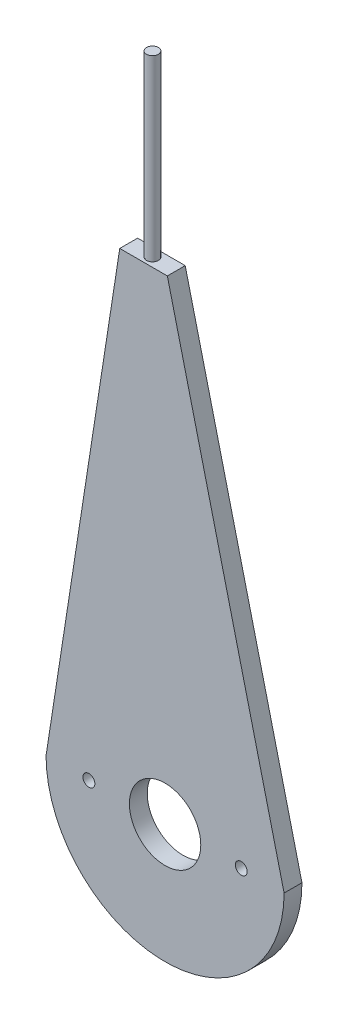
ISO-10303-21;
HEADER;
FILE_DESCRIPTION(('STEP AP214'),'2;1');
FILE_NAME('part.step','',(''),(''),'','','');
FILE_SCHEMA(('AUTOMOTIVE_DESIGN { 1 0 10303 214 1 1 1 1 }'));
ENDSEC;
DATA;
#1=APPLICATION_CONTEXT('core data for automotive mechanical design processes');
#2=APPLICATION_PROTOCOL_DEFINITION('international standard','automotive_design',2000,#1);
#3=PRODUCT_CONTEXT('',#1,'mechanical');
#4=PRODUCT('Part','Part','',(#3));
#5=PRODUCT_RELATED_PRODUCT_CATEGORY('part','',(#4));
#6=PRODUCT_DEFINITION_FORMATION('','',#4);
#7=PRODUCT_DEFINITION_CONTEXT('part definition',#1,'design');
#8=PRODUCT_DEFINITION('design','',#6,#7);
#9=PRODUCT_DEFINITION_SHAPE('','',#8);
#10=(LENGTH_UNIT() NAMED_UNIT(*) SI_UNIT(.MILLI.,.METRE.));
#11=(NAMED_UNIT(*) PLANE_ANGLE_UNIT() SI_UNIT($,.RADIAN.));
#12=(NAMED_UNIT(*) SI_UNIT($,.STERADIAN.) SOLID_ANGLE_UNIT());
#13=UNCERTAINTY_MEASURE_WITH_UNIT(LENGTH_MEASURE(1.E-05),#10,'distance_accuracy_value','');
#14=(GEOMETRIC_REPRESENTATION_CONTEXT(3) GLOBAL_UNCERTAINTY_ASSIGNED_CONTEXT((#13)) GLOBAL_UNIT_ASSIGNED_CONTEXT((#10,
#11,#12)) REPRESENTATION_CONTEXT('',''));
#15=CARTESIAN_POINT('',(0.,0.,0.));
#16=DIRECTION('',(0.,0.,1.));
#17=DIRECTION('',(1.,0.,0.));
#18=AXIS2_PLACEMENT_3D('',#15,#16,#17);
#19=CARTESIAN_POINT('',(-34.2369002432551,-273.477678772343,7.5));
#20=DIRECTION('',(0.988233155114014,-0.15295499708542,0.));
#21=DIRECTION('',(0.15295499708542,0.988233155114014,0.));
#22=AXIS2_PLACEMENT_3D('',#19,#20,#21);
#23=PLANE('',#22);
#24=DIRECTION('',(-0.15295499708542,-0.988233155114014,0.));
#25=VECTOR('',#24,1.);
#26=CARTESIAN_POINT('',(-34.2369002432551,-273.477678772343,0.));
#27=LINE('',#26,#25);
#28=CARTESIAN_POINT('',(-34.2369002432551,-273.477678772343,0.));
#29=VERTEX_POINT('',#28);
#30=CARTESIAN_POINT('',(-65.1921452264642,-473.477678772343,0.));
#31=VERTEX_POINT('',#30);
#32=EDGE_CURVE('E100',#29,#31,#27,.T.);
#33=ORIENTED_EDGE('',*,*,#32,.T.);
#34=DIRECTION('',(0.,0.,-1.));
#35=VECTOR('',#34,1.);
#36=CARTESIAN_POINT('',(-65.1921452264642,-473.477678772343,7.5));
#37=LINE('',#36,#35);
#38=CARTESIAN_POINT('',(-65.1921452264642,-473.477678772343,7.5));
#39=VERTEX_POINT('',#38);
#40=EDGE_CURVE('E37',#39,#31,#37,.T.);
#41=ORIENTED_EDGE('',*,*,#40,.F.);
#42=DIRECTION('',(-0.15295499708542,-0.988233155114014,0.));
#43=VECTOR('',#42,1.);
#44=CARTESIAN_POINT('',(-34.2369002432551,-273.477678772343,7.5));
#45=LINE('',#44,#43);
#46=CARTESIAN_POINT('',(-34.2369002432551,-273.477678772343,7.5));
#47=VERTEX_POINT('',#46);
#48=EDGE_CURVE('E87',#47,#39,#45,.T.);
#49=ORIENTED_EDGE('',*,*,#48,.F.);
#50=DIRECTION('',(0.,0.,-1.));
#51=VECTOR('',#50,1.);
#52=CARTESIAN_POINT('',(-34.2369002432551,-273.477678772343,7.5));
#53=LINE('',#52,#51);
#54=EDGE_CURVE('E96',#47,#29,#53,.T.);
#55=ORIENTED_EDGE('',*,*,#54,.T.);
#56=EDGE_LOOP('',(#33,#41,#49,#55));
#57=FACE_BOUND('',#56,.T.);
#58=ADVANCED_FACE('F34',(#57),#23,.F.);
#59=CARTESIAN_POINT('',(-15.1921452264642,-473.477678772343,7.5));
#60=DIRECTION('',(0.,0.,-1.));
#61=DIRECTION('',(-1.,0.,0.));
#62=AXIS2_PLACEMENT_3D('',#59,#60,#61);
#63=CYLINDRICAL_SURFACE('',#62,50.);
#64=CARTESIAN_POINT('',(-15.1921452264642,-473.477678772343,0.));
#65=DIRECTION('',(0.,0.,1.));
#66=DIRECTION('',(1.,0.,0.));
#67=AXIS2_PLACEMENT_3D('',#64,#65,#66);
#68=CIRCLE('',#67,50.);
#69=CARTESIAN_POINT('',(34.8078547735359,-473.477678772343,0.));
#70=VERTEX_POINT('',#69);
#71=EDGE_CURVE('E92',#31,#70,#68,.T.);
#72=ORIENTED_EDGE('',*,*,#71,.T.);
#73=DIRECTION('',(0.,0.,-1.));
#74=VECTOR('',#73,1.);
#75=CARTESIAN_POINT('',(34.8078547735359,-473.477678772343,7.5));
#76=LINE('',#75,#74);
#77=CARTESIAN_POINT('',(34.8078547735359,-473.477678772343,7.5));
#78=VERTEX_POINT('',#77);
#79=EDGE_CURVE('E90',#78,#70,#76,.T.);
#80=ORIENTED_EDGE('',*,*,#79,.F.);
#81=CARTESIAN_POINT('',(-15.1921452264642,-473.477678772343,7.5));
#82=DIRECTION('',(0.,0.,1.));
#83=DIRECTION('',(1.,0.,0.));
#84=AXIS2_PLACEMENT_3D('',#81,#82,#83);
#85=CIRCLE('',#84,50.);
#86=EDGE_CURVE('E82',#39,#78,#85,.T.);
#87=ORIENTED_EDGE('',*,*,#86,.F.);
#88=ORIENTED_EDGE('',*,*,#40,.T.);
#89=EDGE_LOOP('',(#72,#80,#87,#88));
#90=FACE_BOUND('',#89,.T.);
#91=ADVANCED_FACE('F91',(#90),#63,.T.);
#92=CARTESIAN_POINT('',(-14.2369002432551,-273.477678772343,7.5));
#93=DIRECTION('',(-0.971224154994956,-0.238167253740587,0.));
#94=DIRECTION('',(0.238167253740587,-0.971224154994956,0.));
#95=AXIS2_PLACEMENT_3D('',#92,#93,#94);
#96=PLANE('',#95);
#97=DIRECTION('',(-0.238167253740587,0.971224154994956,0.));
#98=VECTOR('',#97,1.);
#99=CARTESIAN_POINT('',(-14.2369002432551,-273.477678772343,0.));
#100=LINE('',#99,#98);
#101=CARTESIAN_POINT('',(-14.2369002432551,-273.477678772343,0.));
#102=VERTEX_POINT('',#101);
#103=EDGE_CURVE('E68',#70,#102,#100,.T.);
#104=ORIENTED_EDGE('',*,*,#103,.T.);
#105=DIRECTION('',(0.,0.,-1.));
#106=VECTOR('',#105,1.);
#107=CARTESIAN_POINT('',(-14.2369002432551,-273.477678772343,7.5));
#108=LINE('',#107,#106);
#109=CARTESIAN_POINT('',(-14.2369002432551,-273.477678772343,7.5));
#110=VERTEX_POINT('',#109);
#111=EDGE_CURVE('E93',#110,#102,#108,.T.);
#112=ORIENTED_EDGE('',*,*,#111,.F.);
#113=DIRECTION('',(-0.238167253740587,0.971224154994956,0.));
#114=VECTOR('',#113,1.);
#115=CARTESIAN_POINT('',(-14.2369002432551,-273.477678772343,7.5));
#116=LINE('',#115,#114);
#117=EDGE_CURVE('E85',#78,#110,#116,.T.);
#118=ORIENTED_EDGE('',*,*,#117,.F.);
#119=ORIENTED_EDGE('',*,*,#79,.T.);
#120=EDGE_LOOP('',(#104,#112,#118,#119));
#121=FACE_BOUND('',#120,.T.);
#122=ADVANCED_FACE('F94',(#121),#96,.F.);
#123=CARTESIAN_POINT('',(-34.2369002432551,-273.477678772343,7.5));
#124=DIRECTION('',(0.,-1.,0.));
#125=DIRECTION('',(0.,0.,-1.));
#126=AXIS2_PLACEMENT_3D('',#123,#124,#125);
#127=PLANE('',#126);
#128=CARTESIAN_POINT('',(-24.2369002432551,-273.477678772343,3.75));
#129=DIRECTION('',(0.,1.,0.));
#130=DIRECTION('',(0.,0.,1.));
#131=AXIS2_PLACEMENT_3D('',#128,#129,#130);
#132=CIRCLE('',#131,2.5);
#133=CARTESIAN_POINT('',(-24.2369002432551,-273.477678772343,6.25));
#134=VERTEX_POINT('',#133);
#135=EDGE_CURVE('E11',#134,#134,#132,.T.);
#136=ORIENTED_EDGE('',*,*,#135,.F.);
#137=EDGE_LOOP('',(#136));
#138=FACE_BOUND('',#137,.T.);
#139=DIRECTION('',(-1.,0.,0.));
#140=VECTOR('',#139,1.);
#141=CARTESIAN_POINT('',(-34.2369002432551,-273.477678772343,0.));
#142=LINE('',#141,#140);
#143=EDGE_CURVE('E74',#102,#29,#142,.T.);
#144=ORIENTED_EDGE('',*,*,#143,.T.);
#145=ORIENTED_EDGE('',*,*,#54,.F.);
#146=DIRECTION('',(-1.,0.,0.));
#147=VECTOR('',#146,1.);
#148=CARTESIAN_POINT('',(-34.2369002432551,-273.477678772343,7.5));
#149=LINE('',#148,#147);
#150=EDGE_CURVE('E51',#110,#47,#149,.T.);
#151=ORIENTED_EDGE('',*,*,#150,.F.);
#152=ORIENTED_EDGE('',*,*,#111,.T.);
#153=EDGE_LOOP('',(#144,#145,#151,#152));
#154=FACE_BOUND('',#153,.T.);
#155=ADVANCED_FACE('F108',(#138,#154),#127,.F.);
#156=CARTESIAN_POINT('',(-15.1921452264642,-473.477678772343,7.5));
#157=DIRECTION('',(0.,0.,1.));
#158=DIRECTION('',(1.,0.,0.));
#159=AXIS2_PLACEMENT_3D('',#156,#157,#158);
#160=PLANE('',#159);
#161=CARTESIAN_POINT('',(16.8078547735358,-473.477678772343,7.5));
#162=DIRECTION('',(0.,0.,1.));
#163=DIRECTION('',(1.,0.,0.));
#164=AXIS2_PLACEMENT_3D('',#161,#162,#163);
#165=CIRCLE('',#164,2.5);
#166=CARTESIAN_POINT('',(19.3078547735358,-473.477678772343,7.5));
#167=VERTEX_POINT('',#166);
#168=EDGE_CURVE('E126',#167,#167,#165,.T.);
#169=ORIENTED_EDGE('',*,*,#168,.F.);
#170=EDGE_LOOP('',(#169));
#171=FACE_BOUND('',#170,.T.);
#172=CARTESIAN_POINT('',(-47.1921452264642,-473.477678772343,7.5));
#173=DIRECTION('',(0.,0.,1.));
#174=DIRECTION('',(1.,0.,0.));
#175=AXIS2_PLACEMENT_3D('',#172,#173,#174);
#176=CIRCLE('',#175,2.5);
#177=CARTESIAN_POINT('',(-44.6921452264642,-473.477678772343,7.5));
#178=VERTEX_POINT('',#177);
#179=EDGE_CURVE('E120',#178,#178,#176,.T.);
#180=ORIENTED_EDGE('',*,*,#179,.F.);
#181=EDGE_LOOP('',(#180));
#182=FACE_BOUND('',#181,.T.);
#183=CARTESIAN_POINT('',(-15.1921452264642,-473.477678772343,7.5));
#184=DIRECTION('',(0.,0.,1.));
#185=DIRECTION('',(1.,0.,0.));
#186=AXIS2_PLACEMENT_3D('',#183,#184,#185);
#187=CIRCLE('',#186,15.);
#188=CARTESIAN_POINT('',(-0.192145226464185,-473.477678772343,7.5));
#189=VERTEX_POINT('',#188);
#190=EDGE_CURVE('E117',#189,#189,#187,.T.);
#191=ORIENTED_EDGE('',*,*,#190,.F.);
#192=EDGE_LOOP('',(#191));
#193=FACE_BOUND('',#192,.T.);
#194=ORIENTED_EDGE('',*,*,#48,.T.);
#195=ORIENTED_EDGE('',*,*,#86,.T.);
#196=ORIENTED_EDGE('',*,*,#117,.T.);
#197=ORIENTED_EDGE('',*,*,#150,.T.);
#198=EDGE_LOOP('',(#194,#195,#196,#197));
#199=FACE_BOUND('',#198,.T.);
#200=ADVANCED_FACE('F83',(#171,#182,#193,#199),#160,.T.);
#201=CARTESIAN_POINT('',(-15.1921452264642,-473.477678772343,0.));
#202=DIRECTION('',(0.,0.,1.));
#203=DIRECTION('',(1.,0.,0.));
#204=AXIS2_PLACEMENT_3D('',#201,#202,#203);
#205=PLANE('',#204);
#206=CARTESIAN_POINT('',(16.8078547735358,-473.477678772343,0.));
#207=DIRECTION('',(0.,0.,1.));
#208=DIRECTION('',(1.,0.,0.));
#209=AXIS2_PLACEMENT_3D('',#206,#207,#208);
#210=CIRCLE('',#209,2.5);
#211=CARTESIAN_POINT('',(19.3078547735358,-473.477678772343,0.));
#212=VERTEX_POINT('',#211);
#213=EDGE_CURVE('E123',#212,#212,#210,.T.);
#214=ORIENTED_EDGE('',*,*,#213,.T.);
#215=EDGE_LOOP('',(#214));
#216=FACE_BOUND('',#215,.T.);
#217=CARTESIAN_POINT('',(-47.1921452264642,-473.477678772343,0.));
#218=DIRECTION('',(0.,0.,1.));
#219=DIRECTION('',(1.,0.,0.));
#220=AXIS2_PLACEMENT_3D('',#217,#218,#219);
#221=CIRCLE('',#220,2.5);
#222=CARTESIAN_POINT('',(-44.6921452264642,-473.477678772343,0.));
#223=VERTEX_POINT('',#222);
#224=EDGE_CURVE('E129',#223,#223,#221,.T.);
#225=ORIENTED_EDGE('',*,*,#224,.T.);
#226=EDGE_LOOP('',(#225));
#227=FACE_BOUND('',#226,.T.);
#228=CARTESIAN_POINT('',(-15.1921452264642,-473.477678772343,0.));
#229=DIRECTION('',(0.,0.,1.));
#230=DIRECTION('',(1.,0.,0.));
#231=AXIS2_PLACEMENT_3D('',#228,#229,#230);
#232=CIRCLE('',#231,15.);
#233=CARTESIAN_POINT('',(-0.192145226464185,-473.477678772343,0.));
#234=VERTEX_POINT('',#233);
#235=EDGE_CURVE('E116',#234,#234,#232,.T.);
#236=ORIENTED_EDGE('',*,*,#235,.T.);
#237=EDGE_LOOP('',(#236));
#238=FACE_BOUND('',#237,.T.);
#239=ORIENTED_EDGE('',*,*,#32,.F.);
#240=ORIENTED_EDGE('',*,*,#143,.F.);
#241=ORIENTED_EDGE('',*,*,#103,.F.);
#242=ORIENTED_EDGE('',*,*,#71,.F.);
#243=EDGE_LOOP('',(#239,#240,#241,#242));
#244=FACE_BOUND('',#243,.T.);
#245=ADVANCED_FACE('F111',(#216,#227,#238,#244),#205,.F.);
#246=CARTESIAN_POINT('',(-24.2369002432551,-198.477678772343,3.75));
#247=DIRECTION('',(0.,-1.,0.));
#248=DIRECTION('',(0.,0.,-1.));
#249=AXIS2_PLACEMENT_3D('',#246,#247,#248);
#250=CYLINDRICAL_SURFACE('',#249,2.5);
#251=CARTESIAN_POINT('',(-24.2369002432551,-198.477678772343,3.75));
#252=DIRECTION('',(0.,1.,0.));
#253=DIRECTION('',(0.,0.,1.));
#254=AXIS2_PLACEMENT_3D('',#251,#252,#253);
#255=CIRCLE('',#254,2.5);
#256=CARTESIAN_POINT('',(-24.2369002432551,-198.477678772343,6.25));
#257=VERTEX_POINT('',#256);
#258=EDGE_CURVE('E103',#257,#257,#255,.T.);
#259=ORIENTED_EDGE('',*,*,#258,.F.);
#260=EDGE_LOOP('',(#259));
#261=FACE_BOUND('',#260,.T.);
#262=ORIENTED_EDGE('',*,*,#135,.T.);
#263=EDGE_LOOP('',(#262));
#264=FACE_BOUND('',#263,.T.);
#265=ADVANCED_FACE('F155',(#261,#264),#250,.T.);
#266=CARTESIAN_POINT('',(-24.2369002432551,-198.477678772343,3.75));
#267=DIRECTION('',(0.,1.,0.));
#268=DIRECTION('',(0.,0.,1.));
#269=AXIS2_PLACEMENT_3D('',#266,#267,#268);
#270=PLANE('',#269);
#271=ORIENTED_EDGE('',*,*,#258,.T.);
#272=EDGE_LOOP('',(#271));
#273=FACE_BOUND('',#272,.T.);
#274=ADVANCED_FACE('F145',(#273),#270,.T.);
#275=CARTESIAN_POINT('',(-15.1921452264642,-473.477678772343,0.));
#276=DIRECTION('',(0.,0.,1.));
#277=DIRECTION('',(1.,0.,0.));
#278=AXIS2_PLACEMENT_3D('',#275,#276,#277);
#279=CYLINDRICAL_SURFACE('',#278,15.);
#280=ORIENTED_EDGE('',*,*,#235,.F.);
#281=EDGE_LOOP('',(#280));
#282=FACE_BOUND('',#281,.T.);
#283=ORIENTED_EDGE('',*,*,#190,.T.);
#284=EDGE_LOOP('',(#283));
#285=FACE_BOUND('',#284,.T.);
#286=ADVANCED_FACE('F143',(#282,#285),#279,.F.);
#287=CARTESIAN_POINT('',(-47.1921452264642,-473.477678772343,0.));
#288=DIRECTION('',(0.,0.,1.));
#289=DIRECTION('',(1.,0.,0.));
#290=AXIS2_PLACEMENT_3D('',#287,#288,#289);
#291=CYLINDRICAL_SURFACE('',#290,2.5);
#292=ORIENTED_EDGE('',*,*,#224,.F.);
#293=EDGE_LOOP('',(#292));
#294=FACE_BOUND('',#293,.T.);
#295=ORIENTED_EDGE('',*,*,#179,.T.);
#296=EDGE_LOOP('',(#295));
#297=FACE_BOUND('',#296,.T.);
#298=ADVANCED_FACE('F135',(#294,#297),#291,.F.);
#299=CARTESIAN_POINT('',(16.8078547735358,-473.477678772343,0.));
#300=DIRECTION('',(0.,0.,1.));
#301=DIRECTION('',(1.,0.,0.));
#302=AXIS2_PLACEMENT_3D('',#299,#300,#301);
#303=CYLINDRICAL_SURFACE('',#302,2.5);
#304=ORIENTED_EDGE('',*,*,#213,.F.);
#305=EDGE_LOOP('',(#304));
#306=FACE_BOUND('',#305,.T.);
#307=ORIENTED_EDGE('',*,*,#168,.T.);
#308=EDGE_LOOP('',(#307));
#309=FACE_BOUND('',#308,.T.);
#310=ADVANCED_FACE('F152',(#306,#309),#303,.F.);
#311=CLOSED_SHELL('',(#58,#91,#122,#155,#200,#245,#265,#274,#286,#298,#310));
#312=MANIFOLD_SOLID_BREP('B2',#311);
#313=ADVANCED_BREP_SHAPE_REPRESENTATION('',(#18,#312),#14);
#314=SHAPE_DEFINITION_REPRESENTATION(#9,#313);
ENDSEC;
END-ISO-10303-21;
